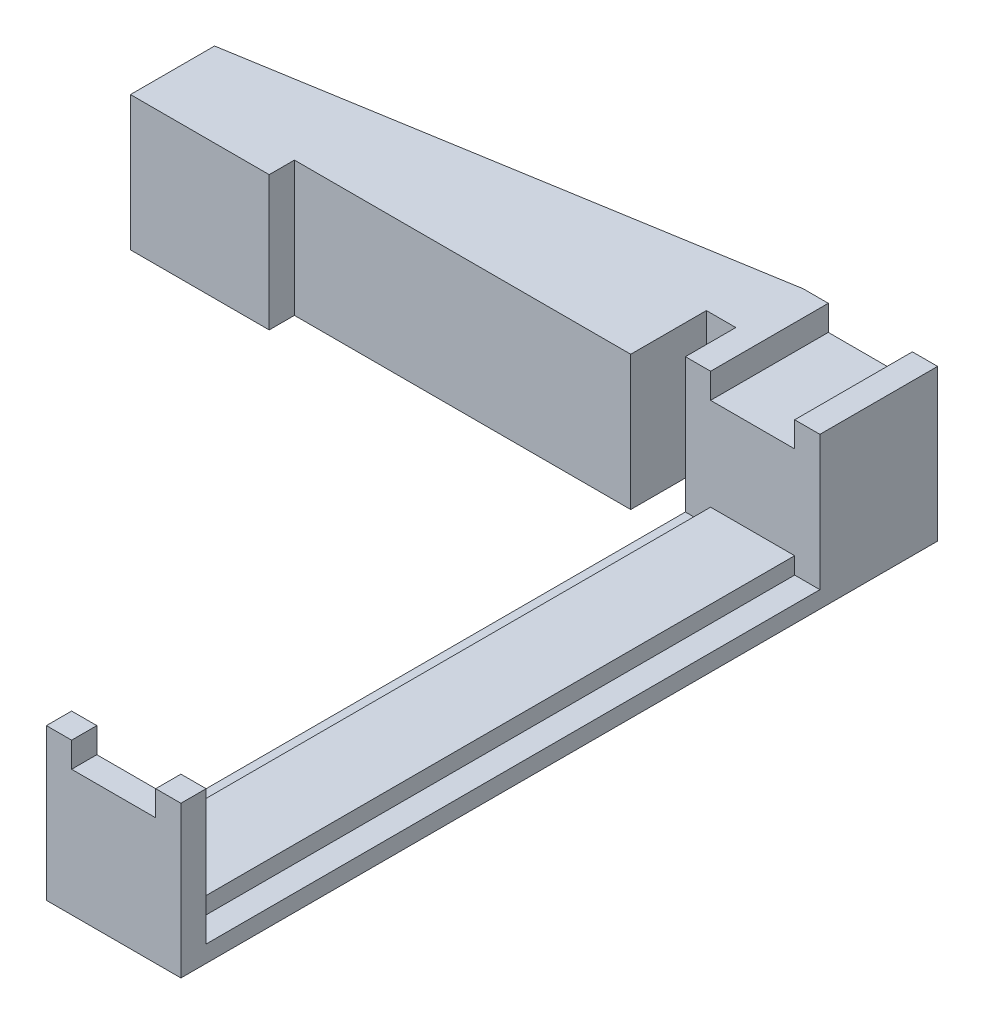
ISO-10303-21;
HEADER;
FILE_DESCRIPTION(('STEP AP214'),'2;1');
FILE_NAME('part.step','',(''),(''),'','','');
FILE_SCHEMA(('AUTOMOTIVE_DESIGN { 1 0 10303 214 1 1 1 1 }'));
ENDSEC;
DATA;
#1=APPLICATION_CONTEXT('core data for automotive mechanical design processes');
#2=APPLICATION_PROTOCOL_DEFINITION('international standard','automotive_design',2000,#1);
#3=PRODUCT_CONTEXT('',#1,'mechanical');
#4=PRODUCT('Part','Part','',(#3));
#5=PRODUCT_RELATED_PRODUCT_CATEGORY('part','',(#4));
#6=PRODUCT_DEFINITION_FORMATION('','',#4);
#7=PRODUCT_DEFINITION_CONTEXT('part definition',#1,'design');
#8=PRODUCT_DEFINITION('design','',#6,#7);
#9=PRODUCT_DEFINITION_SHAPE('','',#8);
#10=(LENGTH_UNIT() NAMED_UNIT(*) SI_UNIT(.MILLI.,.METRE.));
#11=(NAMED_UNIT(*) PLANE_ANGLE_UNIT() SI_UNIT($,.RADIAN.));
#12=(NAMED_UNIT(*) SI_UNIT($,.STERADIAN.) SOLID_ANGLE_UNIT());
#13=UNCERTAINTY_MEASURE_WITH_UNIT(LENGTH_MEASURE(1.E-05),#10,'distance_accuracy_value','');
#14=(GEOMETRIC_REPRESENTATION_CONTEXT(3) GLOBAL_UNCERTAINTY_ASSIGNED_CONTEXT((#13)) GLOBAL_UNIT_ASSIGNED_CONTEXT((#10,
#11,#12)) REPRESENTATION_CONTEXT('',''));
#15=CARTESIAN_POINT('',(0.,0.,0.));
#16=DIRECTION('',(0.,0.,1.));
#17=DIRECTION('',(1.,0.,0.));
#18=AXIS2_PLACEMENT_3D('',#15,#16,#17);
#19=CARTESIAN_POINT('',(0.,9.,0.));
#20=DIRECTION('',(0.,1.,0.));
#21=DIRECTION('',(0.,0.,1.));
#22=AXIS2_PLACEMENT_3D('',#19,#20,#21);
#23=PLANE('',#22);
#24=DIRECTION('',(0.,0.,1.));
#25=VECTOR('',#24,1.);
#26=CARTESIAN_POINT('',(28.25,9.,0.));
#27=LINE('',#26,#25);
#28=CARTESIAN_POINT('',(28.25,9.,-6.));
#29=VERTEX_POINT('',#28);
#30=CARTESIAN_POINT('',(28.25,9.,-1.5));
#31=VERTEX_POINT('',#30);
#32=EDGE_CURVE('E318',#29,#31,#27,.T.);
#33=ORIENTED_EDGE('',*,*,#32,.F.);
#34=DIRECTION('',(-1.,0.,0.));
#35=VECTOR('',#34,1.);
#36=CARTESIAN_POINT('',(28.25,9.,-6.));
#37=LINE('',#36,#35);
#38=CARTESIAN_POINT('',(30.,9.,-6.));
#39=VERTEX_POINT('',#38);
#40=EDGE_CURVE('E254',#39,#29,#37,.T.);
#41=ORIENTED_EDGE('',*,*,#40,.F.);
#42=DIRECTION('',(0.,0.,-1.));
#43=VECTOR('',#42,1.);
#44=CARTESIAN_POINT('',(30.,9.,-3.));
#45=LINE('',#44,#43);
#46=CARTESIAN_POINT('',(30.,9.,-3.));
#47=VERTEX_POINT('',#46);
#48=EDGE_CURVE('E243',#47,#39,#45,.T.);
#49=ORIENTED_EDGE('',*,*,#48,.F.);
#50=DIRECTION('',(-1.,0.,0.));
#51=VECTOR('',#50,1.);
#52=CARTESIAN_POINT('',(30.,9.,-3.));
#53=LINE('',#52,#51);
#54=CARTESIAN_POINT('',(31.5,9.,-3.));
#55=VERTEX_POINT('',#54);
#56=EDGE_CURVE('E370',#55,#47,#53,.T.);
#57=ORIENTED_EDGE('',*,*,#56,.F.);
#58=DIRECTION('',(0.,0.,1.));
#59=VECTOR('',#58,1.);
#60=CARTESIAN_POINT('',(31.5,9.,-10.));
#61=LINE('',#60,#59);
#62=CARTESIAN_POINT('',(31.5,9.,-10.));
#63=VERTEX_POINT('',#62);
#64=EDGE_CURVE('E296',#63,#55,#61,.T.);
#65=ORIENTED_EDGE('',*,*,#64,.F.);
#66=DIRECTION('',(-1.,0.,0.));
#67=VECTOR('',#66,1.);
#68=CARTESIAN_POINT('',(38.,9.,-10.));
#69=LINE('',#68,#67);
#70=CARTESIAN_POINT('',(30.,9.,-10.));
#71=VERTEX_POINT('',#70);
#72=EDGE_CURVE('E395',#63,#71,#69,.T.);
#73=ORIENTED_EDGE('',*,*,#72,.T.);
#74=DIRECTION('',(-0.986393923832144,0.,0.164398987305357));
#75=VECTOR('',#74,1.);
#76=CARTESIAN_POINT('',(30.,9.,-10.));
#77=LINE('',#76,#75);
#78=CARTESIAN_POINT('',(0.,9.,-5.));
#79=VERTEX_POINT('',#78);
#80=EDGE_CURVE('E399',#71,#79,#77,.T.);
#81=ORIENTED_EDGE('',*,*,#80,.T.);
#82=DIRECTION('',(0.,0.,1.));
#83=VECTOR('',#82,1.);
#84=CARTESIAN_POINT('',(0.,9.,-5.));
#85=LINE('',#84,#83);
#86=CARTESIAN_POINT('',(0.,9.,0.));
#87=VERTEX_POINT('',#86);
#88=EDGE_CURVE('E378',#79,#87,#85,.T.);
#89=ORIENTED_EDGE('',*,*,#88,.T.);
#90=DIRECTION('',(1.,0.,0.));
#91=VECTOR('',#90,1.);
#92=CARTESIAN_POINT('',(0.,9.,0.));
#93=LINE('',#92,#91);
#94=CARTESIAN_POINT('',(8.25,9.,0.));
#95=VERTEX_POINT('',#94);
#96=EDGE_CURVE('E381',#87,#95,#93,.T.);
#97=ORIENTED_EDGE('',*,*,#96,.T.);
#98=DIRECTION('',(0.,0.,1.));
#99=VECTOR('',#98,1.);
#100=CARTESIAN_POINT('',(8.25,9.,0.));
#101=LINE('',#100,#99);
#102=CARTESIAN_POINT('',(8.25,9.,-1.5));
#103=VERTEX_POINT('',#102);
#104=EDGE_CURVE('E260',#103,#95,#101,.T.);
#105=ORIENTED_EDGE('',*,*,#104,.F.);
#106=DIRECTION('',(-1.,0.,0.));
#107=VECTOR('',#106,1.);
#108=CARTESIAN_POINT('',(8.25,9.,-1.5));
#109=LINE('',#108,#107);
#110=EDGE_CURVE('E263',#31,#103,#109,.T.);
#111=ORIENTED_EDGE('',*,*,#110,.F.);
#112=EDGE_LOOP('',(#33,#41,#49,#57,#65,#73,#81,#89,#97,#105,#111));
#113=FACE_BOUND('',#112,.T.);
#114=ADVANCED_FACE('F36',(#113),#23,.T.);
#115=CARTESIAN_POINT('',(31.5,9.,33.5));
#116=VERTEX_POINT('',#115);
#117=CARTESIAN_POINT('',(31.5,9.,35.));
#118=VERTEX_POINT('',#117);
#119=EDGE_CURVE('E284',#116,#118,#61,.T.);
#120=ORIENTED_EDGE('',*,*,#119,.F.);
#121=DIRECTION('',(1.,0.,0.));
#122=VECTOR('',#121,1.);
#123=CARTESIAN_POINT('',(30.,9.,33.5));
#124=LINE('',#123,#122);
#125=CARTESIAN_POINT('',(30.,9.,33.5));
#126=VERTEX_POINT('',#125);
#127=EDGE_CURVE('E367',#126,#116,#124,.T.);
#128=ORIENTED_EDGE('',*,*,#127,.F.);
#129=DIRECTION('',(0.,0.,1.));
#130=VECTOR('',#129,1.);
#131=CARTESIAN_POINT('',(30.,9.,0.));
#132=LINE('',#131,#130);
#133=CARTESIAN_POINT('',(30.,9.,35.));
#134=VERTEX_POINT('',#133);
#135=EDGE_CURVE('E385',#126,#134,#132,.T.);
#136=ORIENTED_EDGE('',*,*,#135,.T.);
#137=DIRECTION('',(1.,0.,0.));
#138=VECTOR('',#137,1.);
#139=CARTESIAN_POINT('',(30.,9.,35.));
#140=LINE('',#139,#138);
#141=EDGE_CURVE('E388',#134,#118,#140,.T.);
#142=ORIENTED_EDGE('',*,*,#141,.T.);
#143=EDGE_LOOP('',(#120,#128,#136,#142));
#144=FACE_BOUND('',#143,.T.);
#145=ADVANCED_FACE('F491',(#144),#23,.T.);
#146=DIRECTION('',(0.,0.,-1.));
#147=VECTOR('',#146,1.);
#148=CARTESIAN_POINT('',(36.5,9.,-10.));
#149=LINE('',#148,#147);
#150=CARTESIAN_POINT('',(36.5,9.,-3.));
#151=VERTEX_POINT('',#150);
#152=CARTESIAN_POINT('',(36.5,9.,-10.));
#153=VERTEX_POINT('',#152);
#154=EDGE_CURVE('E298',#151,#153,#149,.T.);
#155=ORIENTED_EDGE('',*,*,#154,.F.);
#156=CARTESIAN_POINT('',(38.,9.,-3.));
#157=VERTEX_POINT('',#156);
#158=EDGE_CURVE('E363',#157,#151,#53,.T.);
#159=ORIENTED_EDGE('',*,*,#158,.F.);
#160=DIRECTION('',(0.,0.,-1.));
#161=VECTOR('',#160,1.);
#162=CARTESIAN_POINT('',(38.,9.,35.));
#163=LINE('',#162,#161);
#164=CARTESIAN_POINT('',(38.,9.,-10.));
#165=VERTEX_POINT('',#164);
#166=EDGE_CURVE('E391',#157,#165,#163,.T.);
#167=ORIENTED_EDGE('',*,*,#166,.T.);
#168=EDGE_CURVE('E396',#165,#153,#69,.T.);
#169=ORIENTED_EDGE('',*,*,#168,.T.);
#170=EDGE_LOOP('',(#155,#159,#167,#169));
#171=FACE_BOUND('',#170,.T.);
#172=ADVANCED_FACE('F517',(#171),#23,.T.);
#173=CARTESIAN_POINT('',(0.,9.,-5.));
#174=DIRECTION('',(1.,0.,0.));
#175=DIRECTION('',(0.,0.,-1.));
#176=AXIS2_PLACEMENT_3D('',#173,#174,#175);
#177=PLANE('',#176);
#178=DIRECTION('',(0.,-1.,0.));
#179=VECTOR('',#178,1.);
#180=CARTESIAN_POINT('',(0.,9.,-5.));
#181=LINE('',#180,#179);
#182=CARTESIAN_POINT('',(0.,1.,-5.));
#183=VERTEX_POINT('',#182);
#184=EDGE_CURVE('E400',#79,#183,#181,.T.);
#185=ORIENTED_EDGE('',*,*,#184,.T.);
#186=DIRECTION('',(0.,0.,-1.));
#187=VECTOR('',#186,1.);
#188=CARTESIAN_POINT('',(0.,1.,-5.));
#189=LINE('',#188,#187);
#190=CARTESIAN_POINT('',(0.,1.,0.));
#191=VERTEX_POINT('',#190);
#192=EDGE_CURVE('E274',#191,#183,#189,.T.);
#193=ORIENTED_EDGE('',*,*,#192,.F.);
#194=DIRECTION('',(0.,-1.,0.));
#195=VECTOR('',#194,1.);
#196=CARTESIAN_POINT('',(0.,9.,0.));
#197=LINE('',#196,#195);
#198=EDGE_CURVE('E422',#87,#191,#197,.T.);
#199=ORIENTED_EDGE('',*,*,#198,.F.);
#200=ORIENTED_EDGE('',*,*,#88,.F.);
#201=EDGE_LOOP('',(#185,#193,#199,#200));
#202=FACE_BOUND('',#201,.T.);
#203=ADVANCED_FACE('F38',(#202),#177,.F.);
#204=CARTESIAN_POINT('',(0.,9.,0.));
#205=DIRECTION('',(0.,0.,-1.));
#206=DIRECTION('',(-1.,0.,0.));
#207=AXIS2_PLACEMENT_3D('',#204,#205,#206);
#208=PLANE('',#207);
#209=DIRECTION('',(-1.,0.,0.));
#210=VECTOR('',#209,1.);
#211=CARTESIAN_POINT('',(0.,1.,0.));
#212=LINE('',#211,#210);
#213=CARTESIAN_POINT('',(8.25,1.,0.));
#214=VERTEX_POINT('',#213);
#215=EDGE_CURVE('E272',#214,#191,#212,.T.);
#216=ORIENTED_EDGE('',*,*,#215,.F.);
#217=DIRECTION('',(0.,1.,0.));
#218=VECTOR('',#217,1.);
#219=CARTESIAN_POINT('',(8.25,0.,0.));
#220=LINE('',#219,#218);
#221=EDGE_CURVE('E265',#214,#95,#220,.T.);
#222=ORIENTED_EDGE('',*,*,#221,.T.);
#223=ORIENTED_EDGE('',*,*,#96,.F.);
#224=ORIENTED_EDGE('',*,*,#198,.T.);
#225=EDGE_LOOP('',(#216,#222,#223,#224));
#226=FACE_BOUND('',#225,.T.);
#227=ADVANCED_FACE('F450',(#226),#208,.F.);
#228=CARTESIAN_POINT('',(30.,9.,0.));
#229=DIRECTION('',(1.,0.,0.));
#230=DIRECTION('',(0.,0.,-1.));
#231=AXIS2_PLACEMENT_3D('',#228,#229,#230);
#232=PLANE('',#231);
#233=DIRECTION('',(0.,1.,0.));
#234=VECTOR('',#233,1.);
#235=CARTESIAN_POINT('',(30.,2.,33.5));
#236=LINE('',#235,#234);
#237=CARTESIAN_POINT('',(30.,0.999999999999999,33.5));
#238=VERTEX_POINT('',#237);
#239=EDGE_CURVE('E366',#238,#126,#236,.T.);
#240=ORIENTED_EDGE('',*,*,#239,.F.);
#241=DIRECTION('',(0.,0.,1.));
#242=VECTOR('',#241,1.);
#243=CARTESIAN_POINT('',(30.,0.999999999999999,-3.));
#244=LINE('',#243,#242);
#245=CARTESIAN_POINT('',(30.,0.999999999999999,-3.));
#246=VERTEX_POINT('',#245);
#247=EDGE_CURVE('E322',#246,#238,#244,.T.);
#248=ORIENTED_EDGE('',*,*,#247,.F.);
#249=DIRECTION('',(0.,1.,0.));
#250=VECTOR('',#249,1.);
#251=CARTESIAN_POINT('',(30.,0.,-3.));
#252=LINE('',#251,#250);
#253=EDGE_CURVE('E248',#246,#47,#252,.T.);
#254=ORIENTED_EDGE('',*,*,#253,.T.);
#255=ORIENTED_EDGE('',*,*,#48,.T.);
#256=DIRECTION('',(0.,1.,0.));
#257=VECTOR('',#256,1.);
#258=CARTESIAN_POINT('',(30.,0.,-6.));
#259=LINE('',#258,#257);
#260=CARTESIAN_POINT('',(30.,0.,-6.));
#261=VERTEX_POINT('',#260);
#262=EDGE_CURVE('E239',#261,#39,#259,.T.);
#263=ORIENTED_EDGE('',*,*,#262,.F.);
#264=DIRECTION('',(0.,0.,1.));
#265=VECTOR('',#264,1.);
#266=CARTESIAN_POINT('',(30.,0.,0.));
#267=LINE('',#266,#265);
#268=CARTESIAN_POINT('',(30.,0.,35.));
#269=VERTEX_POINT('',#268);
#270=EDGE_CURVE('E224',#261,#269,#267,.T.);
#271=ORIENTED_EDGE('',*,*,#270,.T.);
#272=DIRECTION('',(0.,-1.,0.));
#273=VECTOR('',#272,1.);
#274=CARTESIAN_POINT('',(30.,9.,35.));
#275=LINE('',#274,#273);
#276=EDGE_CURVE('E420',#134,#269,#275,.T.);
#277=ORIENTED_EDGE('',*,*,#276,.F.);
#278=ORIENTED_EDGE('',*,*,#135,.F.);
#279=EDGE_LOOP('',(#240,#248,#254,#255,#263,#271,#277,#278));
#280=FACE_BOUND('',#279,.T.);
#281=ADVANCED_FACE('F241',(#280),#232,.F.);
#282=CARTESIAN_POINT('',(30.,9.,35.));
#283=DIRECTION('',(0.,0.,-1.));
#284=DIRECTION('',(-1.,0.,0.));
#285=AXIS2_PLACEMENT_3D('',#282,#283,#284);
#286=PLANE('',#285);
#287=DIRECTION('',(1.,0.,0.));
#288=VECTOR('',#287,1.);
#289=CARTESIAN_POINT('',(31.5,7.5,35.));
#290=LINE('',#289,#288);
#291=CARTESIAN_POINT('',(31.5,7.5,35.));
#292=VERTEX_POINT('',#291);
#293=CARTESIAN_POINT('',(36.5,7.5,35.));
#294=VERTEX_POINT('',#293);
#295=EDGE_CURVE('E286',#292,#294,#290,.T.);
#296=ORIENTED_EDGE('',*,*,#295,.F.);
#297=DIRECTION('',(0.,1.,0.));
#298=VECTOR('',#297,1.);
#299=CARTESIAN_POINT('',(31.5,7.5,35.));
#300=LINE('',#299,#298);
#301=EDGE_CURVE('E295',#292,#118,#300,.T.);
#302=ORIENTED_EDGE('',*,*,#301,.T.);
#303=ORIENTED_EDGE('',*,*,#141,.F.);
#304=ORIENTED_EDGE('',*,*,#276,.T.);
#305=DIRECTION('',(1.,0.,0.));
#306=VECTOR('',#305,1.);
#307=CARTESIAN_POINT('',(30.,0.,35.));
#308=LINE('',#307,#306);
#309=CARTESIAN_POINT('',(38.,0.,35.));
#310=VERTEX_POINT('',#309);
#311=EDGE_CURVE('E232',#269,#310,#308,.T.);
#312=ORIENTED_EDGE('',*,*,#311,.T.);
#313=DIRECTION('',(0.,-1.,0.));
#314=VECTOR('',#313,1.);
#315=CARTESIAN_POINT('',(38.,9.,35.));
#316=LINE('',#315,#314);
#317=CARTESIAN_POINT('',(38.,9.,35.));
#318=VERTEX_POINT('',#317);
#319=EDGE_CURVE('E417',#318,#310,#316,.T.);
#320=ORIENTED_EDGE('',*,*,#319,.F.);
#321=CARTESIAN_POINT('',(36.5,9.,35.));
#322=VERTEX_POINT('',#321);
#323=EDGE_CURVE('E387',#322,#318,#140,.T.);
#324=ORIENTED_EDGE('',*,*,#323,.F.);
#325=DIRECTION('',(0.,1.,0.));
#326=VECTOR('',#325,1.);
#327=CARTESIAN_POINT('',(36.5,7.5,35.));
#328=LINE('',#327,#326);
#329=EDGE_CURVE('E307',#294,#322,#328,.T.);
#330=ORIENTED_EDGE('',*,*,#329,.F.);
#331=EDGE_LOOP('',(#296,#302,#303,#304,#312,#320,#324,#330));
#332=FACE_BOUND('',#331,.T.);
#333=ADVANCED_FACE('F482',(#332),#286,.F.);
#334=CARTESIAN_POINT('',(38.,9.,35.));
#335=DIRECTION('',(-1.,0.,0.));
#336=DIRECTION('',(0.,0.,1.));
#337=AXIS2_PLACEMENT_3D('',#334,#335,#336);
#338=PLANE('',#337);
#339=DIRECTION('',(0.,0.,-1.));
#340=VECTOR('',#339,1.);
#341=CARTESIAN_POINT('',(38.,0.999999999999999,-3.));
#342=LINE('',#341,#340);
#343=CARTESIAN_POINT('',(38.,0.999999999999999,33.5));
#344=VERTEX_POINT('',#343);
#345=CARTESIAN_POINT('',(38.,0.999999999999999,-3.));
#346=VERTEX_POINT('',#345);
#347=EDGE_CURVE('E340',#344,#346,#342,.T.);
#348=ORIENTED_EDGE('',*,*,#347,.F.);
#349=DIRECTION('',(0.,1.,0.));
#350=VECTOR('',#349,1.);
#351=CARTESIAN_POINT('',(38.,2.,33.5));
#352=LINE('',#351,#350);
#353=CARTESIAN_POINT('',(38.,9.,33.5));
#354=VERTEX_POINT('',#353);
#355=EDGE_CURVE('E374',#344,#354,#352,.T.);
#356=ORIENTED_EDGE('',*,*,#355,.T.);
#357=EDGE_CURVE('E392',#318,#354,#163,.T.);
#358=ORIENTED_EDGE('',*,*,#357,.F.);
#359=ORIENTED_EDGE('',*,*,#319,.T.);
#360=DIRECTION('',(0.,0.,-1.));
#361=VECTOR('',#360,1.);
#362=CARTESIAN_POINT('',(38.,0.,35.));
#363=LINE('',#362,#361);
#364=CARTESIAN_POINT('',(38.,0.,-10.));
#365=VERTEX_POINT('',#364);
#366=EDGE_CURVE('E403',#310,#365,#363,.T.);
#367=ORIENTED_EDGE('',*,*,#366,.T.);
#368=DIRECTION('',(0.,-1.,0.));
#369=VECTOR('',#368,1.);
#370=CARTESIAN_POINT('',(38.,9.,-10.));
#371=LINE('',#370,#369);
#372=EDGE_CURVE('E414',#165,#365,#371,.T.);
#373=ORIENTED_EDGE('',*,*,#372,.F.);
#374=ORIENTED_EDGE('',*,*,#166,.F.);
#375=DIRECTION('',(0.,1.,0.));
#376=VECTOR('',#375,1.);
#377=CARTESIAN_POINT('',(38.,2.,-3.));
#378=LINE('',#377,#376);
#379=EDGE_CURVE('E236',#346,#157,#378,.T.);
#380=ORIENTED_EDGE('',*,*,#379,.F.);
#381=EDGE_LOOP('',(#348,#356,#358,#359,#367,#373,#374,#380));
#382=FACE_BOUND('',#381,.T.);
#383=ADVANCED_FACE('F475',(#382),#338,.F.);
#384=CARTESIAN_POINT('',(38.,9.,-10.));
#385=DIRECTION('',(0.,0.,1.));
#386=DIRECTION('',(1.,0.,0.));
#387=AXIS2_PLACEMENT_3D('',#384,#385,#386);
#388=PLANE('',#387);
#389=ORIENTED_EDGE('',*,*,#72,.F.);
#390=DIRECTION('',(0.,1.,0.));
#391=VECTOR('',#390,1.);
#392=CARTESIAN_POINT('',(31.5,7.5,-10.));
#393=LINE('',#392,#391);
#394=CARTESIAN_POINT('',(31.5,7.5,-10.));
#395=VERTEX_POINT('',#394);
#396=EDGE_CURVE('E301',#395,#63,#393,.T.);
#397=ORIENTED_EDGE('',*,*,#396,.F.);
#398=DIRECTION('',(-1.,0.,0.));
#399=VECTOR('',#398,1.);
#400=CARTESIAN_POINT('',(31.5,7.5,-10.));
#401=LINE('',#400,#399);
#402=CARTESIAN_POINT('',(36.5,7.5,-10.));
#403=VERTEX_POINT('',#402);
#404=EDGE_CURVE('E293',#403,#395,#401,.T.);
#405=ORIENTED_EDGE('',*,*,#404,.F.);
#406=DIRECTION('',(0.,1.,0.));
#407=VECTOR('',#406,1.);
#408=CARTESIAN_POINT('',(36.5,7.5,-10.));
#409=LINE('',#408,#407);
#410=EDGE_CURVE('E304',#403,#153,#409,.T.);
#411=ORIENTED_EDGE('',*,*,#410,.T.);
#412=ORIENTED_EDGE('',*,*,#168,.F.);
#413=ORIENTED_EDGE('',*,*,#372,.T.);
#414=DIRECTION('',(-1.,0.,0.));
#415=VECTOR('',#414,1.);
#416=CARTESIAN_POINT('',(38.,0.,-10.));
#417=LINE('',#416,#415);
#418=CARTESIAN_POINT('',(30.,0.,-10.));
#419=VERTEX_POINT('',#418);
#420=EDGE_CURVE('E405',#365,#419,#417,.T.);
#421=ORIENTED_EDGE('',*,*,#420,.T.);
#422=DIRECTION('',(0.,-1.,0.));
#423=VECTOR('',#422,1.);
#424=CARTESIAN_POINT('',(30.,9.,-10.));
#425=LINE('',#424,#423);
#426=EDGE_CURVE('E411',#71,#419,#425,.T.);
#427=ORIENTED_EDGE('',*,*,#426,.F.);
#428=EDGE_LOOP('',(#389,#397,#405,#411,#412,#413,#421,#427));
#429=FACE_BOUND('',#428,.T.);
#430=ADVANCED_FACE('F469',(#429),#388,.F.);
#431=CARTESIAN_POINT('',(30.,9.,-10.));
#432=DIRECTION('',(0.164398987305357,0.,0.986393923832144));
#433=DIRECTION('',(0.986393923832144,0.,-0.164398987305357));
#434=AXIS2_PLACEMENT_3D('',#431,#432,#433);
#435=PLANE('',#434);
#436=DIRECTION('',(-0.986393923832144,0.,0.164398987305357));
#437=VECTOR('',#436,1.);
#438=CARTESIAN_POINT('',(30.,0.,-10.));
#439=LINE('',#438,#437);
#440=CARTESIAN_POINT('',(28.25,0.,-9.70833333333333));
#441=VERTEX_POINT('',#440);
#442=EDGE_CURVE('E382',#419,#441,#439,.T.);
#443=ORIENTED_EDGE('',*,*,#442,.T.);
#444=DIRECTION('',(0.,-1.,0.));
#445=VECTOR('',#444,1.);
#446=CARTESIAN_POINT('',(28.25,1.,-9.70833333333333));
#447=LINE('',#446,#445);
#448=CARTESIAN_POINT('',(28.25,1.,-9.70833333333333));
#449=VERTEX_POINT('',#448);
#450=EDGE_CURVE('E281',#449,#441,#447,.T.);
#451=ORIENTED_EDGE('',*,*,#450,.F.);
#452=DIRECTION('',(0.986393923832144,0.,-0.164398987305357));
#453=VECTOR('',#452,1.);
#454=CARTESIAN_POINT('',(28.25,1.,-9.70833333333333));
#455=LINE('',#454,#453);
#456=EDGE_CURVE('E276',#183,#449,#455,.T.);
#457=ORIENTED_EDGE('',*,*,#456,.F.);
#458=ORIENTED_EDGE('',*,*,#184,.F.);
#459=ORIENTED_EDGE('',*,*,#80,.F.);
#460=ORIENTED_EDGE('',*,*,#426,.T.);
#461=EDGE_LOOP('',(#443,#451,#457,#458,#459,#460));
#462=FACE_BOUND('',#461,.T.);
#463=ADVANCED_FACE('F459',(#462),#435,.F.);
#464=CARTESIAN_POINT('',(36.5,9.,33.5));
#465=VERTEX_POINT('',#464);
#466=EDGE_CURVE('E299',#322,#465,#149,.T.);
#467=ORIENTED_EDGE('',*,*,#466,.F.);
#468=ORIENTED_EDGE('',*,*,#323,.T.);
#469=ORIENTED_EDGE('',*,*,#357,.T.);
#470=EDGE_CURVE('E358',#465,#354,#124,.T.);
#471=ORIENTED_EDGE('',*,*,#470,.F.);
#472=EDGE_LOOP('',(#467,#468,#469,#471));
#473=FACE_BOUND('',#472,.T.);
#474=ADVANCED_FACE('F527',(#473),#23,.T.);
#475=CARTESIAN_POINT('',(0.,0.,0.));
#476=DIRECTION('',(0.,1.,0.));
#477=DIRECTION('',(0.,0.,1.));
#478=AXIS2_PLACEMENT_3D('',#475,#476,#477);
#479=PLANE('',#478);
#480=ORIENTED_EDGE('',*,*,#270,.F.);
#481=DIRECTION('',(-1.,0.,0.));
#482=VECTOR('',#481,1.);
#483=CARTESIAN_POINT('',(28.25,0.,-6.));
#484=LINE('',#483,#482);
#485=CARTESIAN_POINT('',(28.25,0.,-6.));
#486=VERTEX_POINT('',#485);
#487=EDGE_CURVE('E229',#261,#486,#484,.T.);
#488=ORIENTED_EDGE('',*,*,#487,.T.);
#489=DIRECTION('',(0.,0.,1.));
#490=VECTOR('',#489,1.);
#491=CARTESIAN_POINT('',(28.25,0.,0.));
#492=LINE('',#491,#490);
#493=EDGE_CURVE('E267',#441,#486,#492,.T.);
#494=ORIENTED_EDGE('',*,*,#493,.F.);
#495=ORIENTED_EDGE('',*,*,#442,.F.);
#496=ORIENTED_EDGE('',*,*,#420,.F.);
#497=ORIENTED_EDGE('',*,*,#366,.F.);
#498=ORIENTED_EDGE('',*,*,#311,.F.);
#499=EDGE_LOOP('',(#480,#488,#494,#495,#496,#497,#498));
#500=FACE_BOUND('',#499,.T.);
#501=ADVANCED_FACE('F226',(#500),#479,.F.);
#502=CARTESIAN_POINT('',(30.,2.,-3.));
#503=DIRECTION('',(0.,0.,-1.));
#504=DIRECTION('',(-1.,0.,0.));
#505=AXIS2_PLACEMENT_3D('',#502,#503,#504);
#506=PLANE('',#505);
#507=ORIENTED_EDGE('',*,*,#56,.T.);
#508=ORIENTED_EDGE('',*,*,#253,.F.);
#509=DIRECTION('',(-1.,0.,0.));
#510=VECTOR('',#509,1.);
#511=CARTESIAN_POINT('',(30.,0.999999999999999,-3.));
#512=LINE('',#511,#510);
#513=CARTESIAN_POINT('',(31.5,0.999999999999999,-3.));
#514=VERTEX_POINT('',#513);
#515=EDGE_CURVE('E330',#514,#246,#512,.T.);
#516=ORIENTED_EDGE('',*,*,#515,.F.);
#517=DIRECTION('',(0.,1.,0.));
#518=VECTOR('',#517,1.);
#519=CARTESIAN_POINT('',(31.5,0.999999999999999,-3.));
#520=LINE('',#519,#518);
#521=CARTESIAN_POINT('',(31.5,2.,-3.));
#522=VERTEX_POINT('',#521);
#523=EDGE_CURVE('E336',#514,#522,#520,.T.);
#524=ORIENTED_EDGE('',*,*,#523,.T.);
#525=DIRECTION('',(-1.,0.,0.));
#526=VECTOR('',#525,1.);
#527=CARTESIAN_POINT('',(30.,2.,-3.));
#528=LINE('',#527,#526);
#529=CARTESIAN_POINT('',(36.5,2.,-3.));
#530=VERTEX_POINT('',#529);
#531=EDGE_CURVE('E362',#530,#522,#528,.T.);
#532=ORIENTED_EDGE('',*,*,#531,.F.);
#533=DIRECTION('',(0.,1.,0.));
#534=VECTOR('',#533,1.);
#535=CARTESIAN_POINT('',(36.5,0.999999999999999,-3.));
#536=LINE('',#535,#534);
#537=CARTESIAN_POINT('',(36.5,0.999999999999999,-3.));
#538=VERTEX_POINT('',#537);
#539=EDGE_CURVE('E352',#538,#530,#536,.T.);
#540=ORIENTED_EDGE('',*,*,#539,.F.);
#541=DIRECTION('',(-1.,0.,0.));
#542=VECTOR('',#541,1.);
#543=CARTESIAN_POINT('',(38.,0.999999999999999,-3.));
#544=LINE('',#543,#542);
#545=EDGE_CURVE('E343',#346,#538,#544,.T.);
#546=ORIENTED_EDGE('',*,*,#545,.F.);
#547=ORIENTED_EDGE('',*,*,#379,.T.);
#548=ORIENTED_EDGE('',*,*,#158,.T.);
#549=DIRECTION('',(0.,-1.,0.));
#550=VECTOR('',#549,1.);
#551=CARTESIAN_POINT('',(36.5,2.,-3.));
#552=LINE('',#551,#550);
#553=CARTESIAN_POINT('',(36.5,7.5,-3.));
#554=VERTEX_POINT('',#553);
#555=EDGE_CURVE('E312',#151,#554,#552,.T.);
#556=ORIENTED_EDGE('',*,*,#555,.T.);
#557=DIRECTION('',(1.,0.,0.));
#558=VECTOR('',#557,1.);
#559=CARTESIAN_POINT('',(30.,7.5,-3.));
#560=LINE('',#559,#558);
#561=CARTESIAN_POINT('',(31.5,7.5,-3.));
#562=VERTEX_POINT('',#561);
#563=EDGE_CURVE('E303',#562,#554,#560,.T.);
#564=ORIENTED_EDGE('',*,*,#563,.F.);
#565=DIRECTION('',(0.,1.,0.));
#566=VECTOR('',#565,1.);
#567=CARTESIAN_POINT('',(31.5,2.,-3.));
#568=LINE('',#567,#566);
#569=EDGE_CURVE('E315',#562,#55,#568,.T.);
#570=ORIENTED_EDGE('',*,*,#569,.T.);
#571=EDGE_LOOP('',(#507,#508,#516,#524,#532,#540,#546,#547,#548,#556,#564,#570));
#572=FACE_BOUND('',#571,.T.);
#573=ADVANCED_FACE('F504',(#572),#506,.F.);
#574=CARTESIAN_POINT('',(30.,2.,33.5));
#575=DIRECTION('',(0.,0.,1.));
#576=DIRECTION('',(1.,0.,0.));
#577=AXIS2_PLACEMENT_3D('',#574,#575,#576);
#578=PLANE('',#577);
#579=ORIENTED_EDGE('',*,*,#127,.T.);
#580=DIRECTION('',(0.,-1.,0.));
#581=VECTOR('',#580,1.);
#582=CARTESIAN_POINT('',(31.5,2.,33.5));
#583=LINE('',#582,#581);
#584=CARTESIAN_POINT('',(31.5,7.5,33.5));
#585=VERTEX_POINT('',#584);
#586=EDGE_CURVE('E430',#116,#585,#583,.T.);
#587=ORIENTED_EDGE('',*,*,#586,.T.);
#588=DIRECTION('',(-1.,0.,0.));
#589=VECTOR('',#588,1.);
#590=CARTESIAN_POINT('',(30.,7.5,33.5));
#591=LINE('',#590,#589);
#592=CARTESIAN_POINT('',(36.5,7.5,33.5));
#593=VERTEX_POINT('',#592);
#594=EDGE_CURVE('E425',#593,#585,#591,.T.);
#595=ORIENTED_EDGE('',*,*,#594,.F.);
#596=DIRECTION('',(0.,1.,0.));
#597=VECTOR('',#596,1.);
#598=CARTESIAN_POINT('',(36.5,2.,33.5));
#599=LINE('',#598,#597);
#600=EDGE_CURVE('E427',#593,#465,#599,.T.);
#601=ORIENTED_EDGE('',*,*,#600,.T.);
#602=ORIENTED_EDGE('',*,*,#470,.T.);
#603=ORIENTED_EDGE('',*,*,#355,.F.);
#604=DIRECTION('',(1.,0.,0.));
#605=VECTOR('',#604,1.);
#606=CARTESIAN_POINT('',(38.,0.999999999999999,33.5));
#607=LINE('',#606,#605);
#608=CARTESIAN_POINT('',(36.5,0.999999999999999,33.5));
#609=VERTEX_POINT('',#608);
#610=EDGE_CURVE('E349',#609,#344,#607,.T.);
#611=ORIENTED_EDGE('',*,*,#610,.F.);
#612=DIRECTION('',(0.,1.,0.));
#613=VECTOR('',#612,1.);
#614=CARTESIAN_POINT('',(36.5,0.999999999999999,33.5));
#615=LINE('',#614,#613);
#616=CARTESIAN_POINT('',(36.5,2.,33.5));
#617=VERTEX_POINT('',#616);
#618=EDGE_CURVE('E355',#609,#617,#615,.T.);
#619=ORIENTED_EDGE('',*,*,#618,.T.);
#620=DIRECTION('',(1.,0.,0.));
#621=VECTOR('',#620,1.);
#622=CARTESIAN_POINT('',(30.,2.,33.5));
#623=LINE('',#622,#621);
#624=CARTESIAN_POINT('',(31.5,2.,33.5));
#625=VERTEX_POINT('',#624);
#626=EDGE_CURVE('E360',#625,#617,#623,.T.);
#627=ORIENTED_EDGE('',*,*,#626,.F.);
#628=DIRECTION('',(0.,1.,0.));
#629=VECTOR('',#628,1.);
#630=CARTESIAN_POINT('',(31.5,0.999999999999999,33.5));
#631=LINE('',#630,#629);
#632=CARTESIAN_POINT('',(31.5,0.999999999999999,33.5));
#633=VERTEX_POINT('',#632);
#634=EDGE_CURVE('E333',#633,#625,#631,.T.);
#635=ORIENTED_EDGE('',*,*,#634,.F.);
#636=DIRECTION('',(1.,0.,0.));
#637=VECTOR('',#636,1.);
#638=CARTESIAN_POINT('',(30.,0.999999999999999,33.5));
#639=LINE('',#638,#637);
#640=EDGE_CURVE('E324',#238,#633,#639,.T.);
#641=ORIENTED_EDGE('',*,*,#640,.F.);
#642=ORIENTED_EDGE('',*,*,#239,.T.);
#643=EDGE_LOOP('',(#579,#587,#595,#601,#602,#603,#611,#619,#627,#635,#641,#642));
#644=FACE_BOUND('',#643,.T.);
#645=ADVANCED_FACE('F493',(#644),#578,.F.);
#646=CARTESIAN_POINT('',(0.,2.,0.));
#647=DIRECTION('',(0.,1.,0.));
#648=DIRECTION('',(0.,0.,1.));
#649=AXIS2_PLACEMENT_3D('',#646,#647,#648);
#650=PLANE('',#649);
#651=DIRECTION('',(0.,0.,-1.));
#652=VECTOR('',#651,1.);
#653=CARTESIAN_POINT('',(31.5,2.,-3.));
#654=LINE('',#653,#652);
#655=EDGE_CURVE('E321',#625,#522,#654,.T.);
#656=ORIENTED_EDGE('',*,*,#655,.F.);
#657=ORIENTED_EDGE('',*,*,#626,.T.);
#658=DIRECTION('',(0.,0.,1.));
#659=VECTOR('',#658,1.);
#660=CARTESIAN_POINT('',(36.5,2.,-3.));
#661=LINE('',#660,#659);
#662=EDGE_CURVE('E338',#530,#617,#661,.T.);
#663=ORIENTED_EDGE('',*,*,#662,.F.);
#664=ORIENTED_EDGE('',*,*,#531,.T.);
#665=EDGE_LOOP('',(#656,#657,#663,#664));
#666=FACE_BOUND('',#665,.T.);
#667=ADVANCED_FACE('F723',(#666),#650,.T.);
#668=CARTESIAN_POINT('',(36.5,0.999999999999999,-3.));
#669=DIRECTION('',(-1.,0.,0.));
#670=DIRECTION('',(0.,0.,1.));
#671=AXIS2_PLACEMENT_3D('',#668,#669,#670);
#672=PLANE('',#671);
#673=ORIENTED_EDGE('',*,*,#662,.T.);
#674=ORIENTED_EDGE('',*,*,#618,.F.);
#675=DIRECTION('',(0.,0.,1.));
#676=VECTOR('',#675,1.);
#677=CARTESIAN_POINT('',(36.5,0.999999999999999,-3.));
#678=LINE('',#677,#676);
#679=EDGE_CURVE('E346',#538,#609,#678,.T.);
#680=ORIENTED_EDGE('',*,*,#679,.F.);
#681=ORIENTED_EDGE('',*,*,#539,.T.);
#682=EDGE_LOOP('',(#673,#674,#680,#681));
#683=FACE_BOUND('',#682,.T.);
#684=ADVANCED_FACE('F736',(#683),#672,.F.);
#685=CARTESIAN_POINT('',(0.,0.999999999999999,0.));
#686=DIRECTION('',(0.,-1.,0.));
#687=DIRECTION('',(0.,0.,-1.));
#688=AXIS2_PLACEMENT_3D('',#685,#686,#687);
#689=PLANE('',#688);
#690=ORIENTED_EDGE('',*,*,#347,.T.);
#691=ORIENTED_EDGE('',*,*,#545,.T.);
#692=ORIENTED_EDGE('',*,*,#679,.T.);
#693=ORIENTED_EDGE('',*,*,#610,.T.);
#694=EDGE_LOOP('',(#690,#691,#692,#693));
#695=FACE_BOUND('',#694,.T.);
#696=ADVANCED_FACE('F520',(#695),#689,.F.);
#697=CARTESIAN_POINT('',(31.5,0.999999999999999,-3.));
#698=DIRECTION('',(1.,0.,0.));
#699=DIRECTION('',(0.,0.,-1.));
#700=AXIS2_PLACEMENT_3D('',#697,#698,#699);
#701=PLANE('',#700);
#702=ORIENTED_EDGE('',*,*,#655,.T.);
#703=ORIENTED_EDGE('',*,*,#523,.F.);
#704=DIRECTION('',(0.,0.,-1.));
#705=VECTOR('',#704,1.);
#706=CARTESIAN_POINT('',(31.5,0.999999999999999,-3.));
#707=LINE('',#706,#705);
#708=EDGE_CURVE('E327',#633,#514,#707,.T.);
#709=ORIENTED_EDGE('',*,*,#708,.F.);
#710=ORIENTED_EDGE('',*,*,#634,.T.);
#711=EDGE_LOOP('',(#702,#703,#709,#710));
#712=FACE_BOUND('',#711,.T.);
#713=ADVANCED_FACE('F652',(#712),#701,.F.);
#714=CARTESIAN_POINT('',(0.,0.999999999999999,0.));
#715=DIRECTION('',(0.,1.,0.));
#716=DIRECTION('',(0.,0.,1.));
#717=AXIS2_PLACEMENT_3D('',#714,#715,#716);
#718=PLANE('',#717);
#719=ORIENTED_EDGE('',*,*,#247,.T.);
#720=ORIENTED_EDGE('',*,*,#640,.T.);
#721=ORIENTED_EDGE('',*,*,#708,.T.);
#722=ORIENTED_EDGE('',*,*,#515,.T.);
#723=EDGE_LOOP('',(#719,#720,#721,#722));
#724=FACE_BOUND('',#723,.T.);
#725=ADVANCED_FACE('F498',(#724),#718,.T.);
#726=CARTESIAN_POINT('',(28.25,0.,0.));
#727=DIRECTION('',(-1.,0.,0.));
#728=DIRECTION('',(0.,0.,1.));
#729=AXIS2_PLACEMENT_3D('',#726,#727,#728);
#730=PLANE('',#729);
#731=ORIENTED_EDGE('',*,*,#32,.T.);
#732=DIRECTION('',(0.,1.,0.));
#733=VECTOR('',#732,1.);
#734=CARTESIAN_POINT('',(28.25,0.,-1.5));
#735=LINE('',#734,#733);
#736=CARTESIAN_POINT('',(28.25,1.,-1.5));
#737=VERTEX_POINT('',#736);
#738=EDGE_CURVE('E268',#737,#31,#735,.T.);
#739=ORIENTED_EDGE('',*,*,#738,.F.);
#740=DIRECTION('',(0.,0.,-1.));
#741=VECTOR('',#740,1.);
#742=CARTESIAN_POINT('',(28.25,1.,0.));
#743=LINE('',#742,#741);
#744=CARTESIAN_POINT('',(28.25,1.,-6.));
#745=VERTEX_POINT('',#744);
#746=EDGE_CURVE('E433',#737,#745,#743,.T.);
#747=ORIENTED_EDGE('',*,*,#746,.T.);
#748=DIRECTION('',(0.,1.,0.));
#749=VECTOR('',#748,1.);
#750=CARTESIAN_POINT('',(28.25,0.,-6.));
#751=LINE('',#750,#749);
#752=EDGE_CURVE('E247',#745,#29,#751,.T.);
#753=ORIENTED_EDGE('',*,*,#752,.T.);
#754=EDGE_LOOP('',(#731,#739,#747,#753));
#755=FACE_BOUND('',#754,.T.);
#756=ADVANCED_FACE('F443',(#755),#730,.F.);
#757=CARTESIAN_POINT('',(0.,7.5,0.));
#758=DIRECTION('',(0.,1.,0.));
#759=DIRECTION('',(0.,0.,1.));
#760=AXIS2_PLACEMENT_3D('',#757,#758,#759);
#761=PLANE('',#760);
#762=ORIENTED_EDGE('',*,*,#594,.T.);
#763=DIRECTION('',(0.,0.,1.));
#764=VECTOR('',#763,1.);
#765=CARTESIAN_POINT('',(31.5,7.5,-10.));
#766=LINE('',#765,#764);
#767=EDGE_CURVE('E287',#585,#292,#766,.T.);
#768=ORIENTED_EDGE('',*,*,#767,.T.);
#769=ORIENTED_EDGE('',*,*,#295,.T.);
#770=DIRECTION('',(0.,0.,-1.));
#771=VECTOR('',#770,1.);
#772=CARTESIAN_POINT('',(36.5,7.5,-10.));
#773=LINE('',#772,#771);
#774=EDGE_CURVE('E291',#294,#593,#773,.T.);
#775=ORIENTED_EDGE('',*,*,#774,.T.);
#776=EDGE_LOOP('',(#762,#768,#769,#775));
#777=FACE_BOUND('',#776,.T.);
#778=ADVANCED_FACE('F532',(#777),#761,.T.);
#779=CARTESIAN_POINT('',(36.5,7.5,-10.));
#780=DIRECTION('',(1.,0.,0.));
#781=DIRECTION('',(0.,0.,-1.));
#782=AXIS2_PLACEMENT_3D('',#779,#780,#781);
#783=PLANE('',#782);
#784=ORIENTED_EDGE('',*,*,#774,.F.);
#785=ORIENTED_EDGE('',*,*,#329,.T.);
#786=ORIENTED_EDGE('',*,*,#466,.T.);
#787=ORIENTED_EDGE('',*,*,#600,.F.);
#788=EDGE_LOOP('',(#784,#785,#786,#787));
#789=FACE_BOUND('',#788,.T.);
#790=ADVANCED_FACE('F529',(#789),#783,.F.);
#791=CARTESIAN_POINT('',(31.5,7.5,-10.));
#792=DIRECTION('',(-1.,0.,0.));
#793=DIRECTION('',(0.,0.,1.));
#794=AXIS2_PLACEMENT_3D('',#791,#792,#793);
#795=PLANE('',#794);
#796=ORIENTED_EDGE('',*,*,#119,.T.);
#797=ORIENTED_EDGE('',*,*,#301,.F.);
#798=ORIENTED_EDGE('',*,*,#767,.F.);
#799=ORIENTED_EDGE('',*,*,#586,.F.);
#800=EDGE_LOOP('',(#796,#797,#798,#799));
#801=FACE_BOUND('',#800,.T.);
#802=ADVANCED_FACE('F535',(#801),#795,.F.);
#803=EDGE_CURVE('E59',#395,#562,#766,.T.);
#804=ORIENTED_EDGE('',*,*,#803,.F.);
#805=ORIENTED_EDGE('',*,*,#396,.T.);
#806=ORIENTED_EDGE('',*,*,#64,.T.);
#807=ORIENTED_EDGE('',*,*,#569,.F.);
#808=EDGE_LOOP('',(#804,#805,#806,#807));
#809=FACE_BOUND('',#808,.T.);
#810=ADVANCED_FACE('F507',(#809),#795,.F.);
#811=ORIENTED_EDGE('',*,*,#154,.T.);
#812=ORIENTED_EDGE('',*,*,#410,.F.);
#813=EDGE_CURVE('E290',#554,#403,#773,.T.);
#814=ORIENTED_EDGE('',*,*,#813,.F.);
#815=ORIENTED_EDGE('',*,*,#555,.F.);
#816=EDGE_LOOP('',(#811,#812,#814,#815));
#817=FACE_BOUND('',#816,.T.);
#818=ADVANCED_FACE('F513',(#817),#783,.F.);
#819=ORIENTED_EDGE('',*,*,#563,.T.);
#820=ORIENTED_EDGE('',*,*,#813,.T.);
#821=ORIENTED_EDGE('',*,*,#404,.T.);
#822=ORIENTED_EDGE('',*,*,#803,.T.);
#823=EDGE_LOOP('',(#819,#820,#821,#822));
#824=FACE_BOUND('',#823,.T.);
#825=ADVANCED_FACE('F510',(#824),#761,.T.);
#826=CARTESIAN_POINT('',(28.25,1.,0.));
#827=DIRECTION('',(1.,0.,0.));
#828=DIRECTION('',(0.,0.,-1.));
#829=AXIS2_PLACEMENT_3D('',#826,#827,#828);
#830=PLANE('',#829);
#831=ORIENTED_EDGE('',*,*,#493,.T.);
#832=EDGE_CURVE('E253',#486,#745,#751,.T.);
#833=ORIENTED_EDGE('',*,*,#832,.T.);
#834=DIRECTION('',(0.,0.,1.));
#835=VECTOR('',#834,1.);
#836=CARTESIAN_POINT('',(28.25,1.,0.));
#837=LINE('',#836,#835);
#838=EDGE_CURVE('E278',#449,#745,#837,.T.);
#839=ORIENTED_EDGE('',*,*,#838,.F.);
#840=ORIENTED_EDGE('',*,*,#450,.T.);
#841=EDGE_LOOP('',(#831,#833,#839,#840));
#842=FACE_BOUND('',#841,.T.);
#843=ADVANCED_FACE('F463',(#842),#830,.F.);
#844=CARTESIAN_POINT('',(0.,1.,0.));
#845=DIRECTION('',(0.,1.,0.));
#846=DIRECTION('',(0.,0.,1.));
#847=AXIS2_PLACEMENT_3D('',#844,#845,#846);
#848=PLANE('',#847);
#849=DIRECTION('',(-1.,0.,0.));
#850=VECTOR('',#849,1.);
#851=CARTESIAN_POINT('',(0.,1.,-1.5));
#852=LINE('',#851,#850);
#853=CARTESIAN_POINT('',(8.25,1.,-1.5));
#854=VERTEX_POINT('',#853);
#855=EDGE_CURVE('E44',#737,#854,#852,.T.);
#856=ORIENTED_EDGE('',*,*,#855,.T.);
#857=DIRECTION('',(0.,0.,1.));
#858=VECTOR('',#857,1.);
#859=CARTESIAN_POINT('',(8.25,1.,0.));
#860=LINE('',#859,#858);
#861=EDGE_CURVE('E11',#854,#214,#860,.T.);
#862=ORIENTED_EDGE('',*,*,#861,.T.);
#863=ORIENTED_EDGE('',*,*,#215,.T.);
#864=ORIENTED_EDGE('',*,*,#192,.T.);
#865=ORIENTED_EDGE('',*,*,#456,.T.);
#866=ORIENTED_EDGE('',*,*,#838,.T.);
#867=ORIENTED_EDGE('',*,*,#746,.F.);
#868=EDGE_LOOP('',(#856,#862,#863,#864,#865,#866,#867));
#869=FACE_BOUND('',#868,.T.);
#870=ADVANCED_FACE('F437',(#869),#848,.F.);
#871=CARTESIAN_POINT('',(8.25,0.,0.));
#872=DIRECTION('',(-1.,0.,0.));
#873=DIRECTION('',(0.,0.,1.));
#874=AXIS2_PLACEMENT_3D('',#871,#872,#873);
#875=PLANE('',#874);
#876=DIRECTION('',(0.,1.,0.));
#877=VECTOR('',#876,1.);
#878=CARTESIAN_POINT('',(8.25,0.,-1.5));
#879=LINE('',#878,#877);
#880=EDGE_CURVE('E51',#854,#103,#879,.T.);
#881=ORIENTED_EDGE('',*,*,#880,.T.);
#882=ORIENTED_EDGE('',*,*,#104,.T.);
#883=ORIENTED_EDGE('',*,*,#221,.F.);
#884=ORIENTED_EDGE('',*,*,#861,.F.);
#885=EDGE_LOOP('',(#881,#882,#883,#884));
#886=FACE_BOUND('',#885,.T.);
#887=ADVANCED_FACE('F448',(#886),#875,.F.);
#888=CARTESIAN_POINT('',(8.25,0.,-1.5));
#889=DIRECTION('',(0.,0.,-1.));
#890=DIRECTION('',(-1.,0.,0.));
#891=AXIS2_PLACEMENT_3D('',#888,#889,#890);
#892=PLANE('',#891);
#893=ORIENTED_EDGE('',*,*,#738,.T.);
#894=ORIENTED_EDGE('',*,*,#110,.T.);
#895=ORIENTED_EDGE('',*,*,#880,.F.);
#896=ORIENTED_EDGE('',*,*,#855,.F.);
#897=EDGE_LOOP('',(#893,#894,#895,#896));
#898=FACE_BOUND('',#897,.T.);
#899=ADVANCED_FACE('F440',(#898),#892,.F.);
#900=CARTESIAN_POINT('',(28.25,0.,-6.));
#901=DIRECTION('',(0.,0.,-1.));
#902=DIRECTION('',(-1.,0.,0.));
#903=AXIS2_PLACEMENT_3D('',#900,#901,#902);
#904=PLANE('',#903);
#905=ORIENTED_EDGE('',*,*,#40,.T.);
#906=ORIENTED_EDGE('',*,*,#752,.F.);
#907=ORIENTED_EDGE('',*,*,#832,.F.);
#908=ORIENTED_EDGE('',*,*,#487,.F.);
#909=ORIENTED_EDGE('',*,*,#262,.T.);
#910=EDGE_LOOP('',(#905,#906,#907,#908,#909));
#911=FACE_BOUND('',#910,.T.);
#912=ADVANCED_FACE('F250',(#911),#904,.F.);
#913=CLOSED_SHELL('',(#114,#145,#172,#203,#227,#281,#333,#383,#430,#463,#474,#501,#573,#645,
#667,#684,#696,#713,#725,#756,#778,#790,#802,#810,#818,#825,#843,#870,#887,#899,#912));
#914=MANIFOLD_SOLID_BREP('B2',#913);
#915=ADVANCED_BREP_SHAPE_REPRESENTATION('',(#18,#914),#14);
#916=SHAPE_DEFINITION_REPRESENTATION(#9,#915);
ENDSEC;
END-ISO-10303-21;
